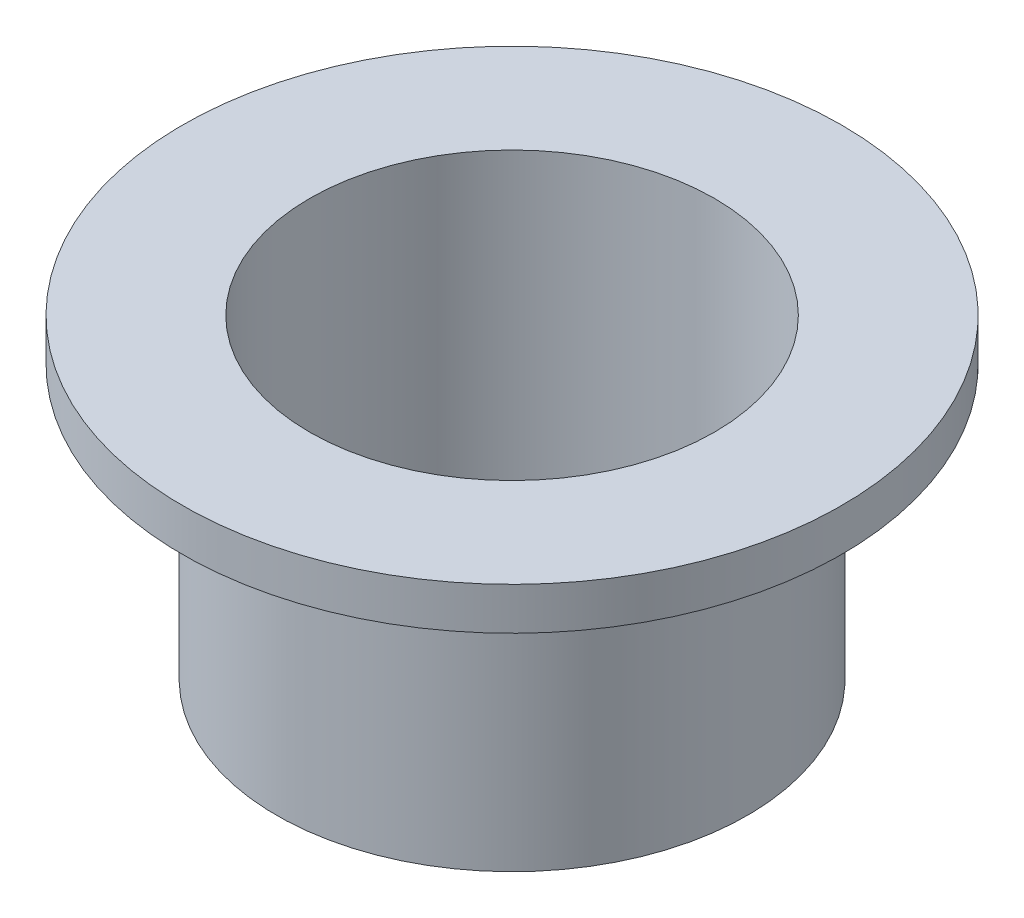
ISO-10303-21;
HEADER;
FILE_DESCRIPTION(('STEP AP214'),'2;1');
FILE_NAME('part.step','',(''),(''),'','','');
FILE_SCHEMA(('AUTOMOTIVE_DESIGN { 1 0 10303 214 1 1 1 1 }'));
ENDSEC;
DATA;
#1=APPLICATION_CONTEXT('core data for automotive mechanical design processes');
#2=APPLICATION_PROTOCOL_DEFINITION('international standard','automotive_design',2000,#1);
#3=PRODUCT_CONTEXT('',#1,'mechanical');
#4=PRODUCT('Part','Part','',(#3));
#5=PRODUCT_RELATED_PRODUCT_CATEGORY('part','',(#4));
#6=PRODUCT_DEFINITION_FORMATION('','',#4);
#7=PRODUCT_DEFINITION_CONTEXT('part definition',#1,'design');
#8=PRODUCT_DEFINITION('design','',#6,#7);
#9=PRODUCT_DEFINITION_SHAPE('','',#8);
#10=(LENGTH_UNIT() NAMED_UNIT(*) SI_UNIT(.MILLI.,.METRE.));
#11=(NAMED_UNIT(*) PLANE_ANGLE_UNIT() SI_UNIT($,.RADIAN.));
#12=(NAMED_UNIT(*) SI_UNIT($,.STERADIAN.) SOLID_ANGLE_UNIT());
#13=UNCERTAINTY_MEASURE_WITH_UNIT(LENGTH_MEASURE(1.E-05),#10,'distance_accuracy_value','');
#14=(GEOMETRIC_REPRESENTATION_CONTEXT(3) GLOBAL_UNCERTAINTY_ASSIGNED_CONTEXT((#13)) GLOBAL_UNIT_ASSIGNED_CONTEXT((#10,
#11,#12)) REPRESENTATION_CONTEXT('',''));
#15=CARTESIAN_POINT('',(0.,0.,0.));
#16=DIRECTION('',(0.,0.,1.));
#17=DIRECTION('',(1.,0.,0.));
#18=AXIS2_PLACEMENT_3D('',#15,#16,#17);
#19=CARTESIAN_POINT('',(-43.,-58.,0.));
#20=DIRECTION('',(0.,1.,0.));
#21=DIRECTION('',(0.,0.,1.));
#22=AXIS2_PLACEMENT_3D('',#19,#20,#21);
#23=PLANE('',#22);
#24=CARTESIAN_POINT('',(0.,-58.,0.));
#25=DIRECTION('',(0.,-1.,0.));
#26=DIRECTION('',(0.,0.,-1.));
#27=AXIS2_PLACEMENT_3D('',#24,#25,#26);
#28=CIRCLE('',#27,43.);
#29=CARTESIAN_POINT('',(0.,-58.,-43.));
#30=VERTEX_POINT('',#29);
#31=EDGE_CURVE('E59',#30,#30,#28,.T.);
#32=ORIENTED_EDGE('',*,*,#31,.F.);
#33=EDGE_LOOP('',(#32));
#34=FACE_BOUND('',#33,.T.);
#35=CARTESIAN_POINT('',(0.,-58.,0.));
#36=DIRECTION('',(0.,-1.,0.));
#37=DIRECTION('',(0.,0.,-1.));
#38=AXIS2_PLACEMENT_3D('',#35,#36,#37);
#39=CIRCLE('',#38,50.);
#40=CARTESIAN_POINT('',(0.,-58.,-50.));
#41=VERTEX_POINT('',#40);
#42=EDGE_CURVE('E10',#41,#41,#39,.T.);
#43=ORIENTED_EDGE('',*,*,#42,.T.);
#44=EDGE_LOOP('',(#43));
#45=FACE_BOUND('',#44,.T.);
#46=ADVANCED_FACE('F37',(#34,#45),#23,.F.);
#47=CARTESIAN_POINT('',(0.,-147.995737503109,0.));
#48=DIRECTION('',(0.,-1.,0.));
#49=DIRECTION('',(0.,0.,-1.));
#50=AXIS2_PLACEMENT_3D('',#47,#48,#49);
#51=CYLINDRICAL_SURFACE('',#50,50.);
#52=ORIENTED_EDGE('',*,*,#42,.F.);
#53=EDGE_LOOP('',(#52));
#54=FACE_BOUND('',#53,.T.);
#55=CARTESIAN_POINT('',(0.,0.,0.));
#56=DIRECTION('',(0.,-1.,0.));
#57=DIRECTION('',(0.,0.,-1.));
#58=AXIS2_PLACEMENT_3D('',#55,#56,#57);
#59=CIRCLE('',#58,50.);
#60=CARTESIAN_POINT('',(0.,0.,-50.));
#61=VERTEX_POINT('',#60);
#62=EDGE_CURVE('E43',#61,#61,#59,.T.);
#63=ORIENTED_EDGE('',*,*,#62,.T.);
#64=EDGE_LOOP('',(#63));
#65=FACE_BOUND('',#64,.T.);
#66=ADVANCED_FACE('F66',(#54,#65),#51,.T.);
#67=CARTESIAN_POINT('',(-50.,0.,0.));
#68=DIRECTION('',(0.,1.,0.));
#69=DIRECTION('',(0.,0.,1.));
#70=AXIS2_PLACEMENT_3D('',#67,#68,#69);
#71=PLANE('',#70);
#72=ORIENTED_EDGE('',*,*,#62,.F.);
#73=EDGE_LOOP('',(#72));
#74=FACE_BOUND('',#73,.T.);
#75=CARTESIAN_POINT('',(0.,0.,0.));
#76=DIRECTION('',(0.,-1.,0.));
#77=DIRECTION('',(0.,0.,-1.));
#78=AXIS2_PLACEMENT_3D('',#75,#76,#77);
#79=CIRCLE('',#78,70.);
#80=CARTESIAN_POINT('',(0.,0.,-70.));
#81=VERTEX_POINT('',#80);
#82=EDGE_CURVE('E47',#81,#81,#79,.T.);
#83=ORIENTED_EDGE('',*,*,#82,.T.);
#84=EDGE_LOOP('',(#83));
#85=FACE_BOUND('',#84,.T.);
#86=ADVANCED_FACE('F70',(#74,#85),#71,.F.);
#87=CARTESIAN_POINT('',(0.,-147.995737503109,0.));
#88=DIRECTION('',(0.,-1.,0.));
#89=DIRECTION('',(0.,0.,-1.));
#90=AXIS2_PLACEMENT_3D('',#87,#88,#89);
#91=CYLINDRICAL_SURFACE('',#90,70.);
#92=ORIENTED_EDGE('',*,*,#82,.F.);
#93=EDGE_LOOP('',(#92));
#94=FACE_BOUND('',#93,.T.);
#95=CARTESIAN_POINT('',(0.,9.00000000000001,0.));
#96=DIRECTION('',(0.,-1.,0.));
#97=DIRECTION('',(0.,0.,-1.));
#98=AXIS2_PLACEMENT_3D('',#95,#96,#97);
#99=CIRCLE('',#98,70.);
#100=CARTESIAN_POINT('',(0.,9.00000000000001,-70.));
#101=VERTEX_POINT('',#100);
#102=EDGE_CURVE('E51',#101,#101,#99,.T.);
#103=ORIENTED_EDGE('',*,*,#102,.T.);
#104=EDGE_LOOP('',(#103));
#105=FACE_BOUND('',#104,.T.);
#106=ADVANCED_FACE('F75',(#94,#105),#91,.T.);
#107=CARTESIAN_POINT('',(-70.,9.00000000000001,0.));
#108=DIRECTION('',(0.,-1.,0.));
#109=DIRECTION('',(0.,0.,-1.));
#110=AXIS2_PLACEMENT_3D('',#107,#108,#109);
#111=PLANE('',#110);
#112=ORIENTED_EDGE('',*,*,#102,.F.);
#113=EDGE_LOOP('',(#112));
#114=FACE_BOUND('',#113,.T.);
#115=CARTESIAN_POINT('',(0.,9.00000000000001,0.));
#116=DIRECTION('',(0.,-1.,0.));
#117=DIRECTION('',(0.,0.,-1.));
#118=AXIS2_PLACEMENT_3D('',#115,#116,#117);
#119=CIRCLE('',#118,43.);
#120=CARTESIAN_POINT('',(0.,9.00000000000001,-43.));
#121=VERTEX_POINT('',#120);
#122=EDGE_CURVE('E56',#121,#121,#119,.T.);
#123=ORIENTED_EDGE('',*,*,#122,.T.);
#124=EDGE_LOOP('',(#123));
#125=FACE_BOUND('',#124,.T.);
#126=ADVANCED_FACE('F81',(#114,#125),#111,.F.);
#127=CARTESIAN_POINT('',(0.,-147.995737503109,0.));
#128=DIRECTION('',(0.,-1.,0.));
#129=DIRECTION('',(0.,0.,-1.));
#130=AXIS2_PLACEMENT_3D('',#127,#128,#129);
#131=CYLINDRICAL_SURFACE('',#130,43.);
#132=ORIENTED_EDGE('',*,*,#122,.F.);
#133=EDGE_LOOP('',(#132));
#134=FACE_BOUND('',#133,.T.);
#135=ORIENTED_EDGE('',*,*,#31,.T.);
#136=EDGE_LOOP('',(#135));
#137=FACE_BOUND('',#136,.T.);
#138=ADVANCED_FACE('F63',(#134,#137),#131,.F.);
#139=CLOSED_SHELL('',(#46,#66,#86,#106,#126,#138));
#140=MANIFOLD_SOLID_BREP('B2',#139);
#141=ADVANCED_BREP_SHAPE_REPRESENTATION('',(#18,#140),#14);
#142=SHAPE_DEFINITION_REPRESENTATION(#9,#141);
ENDSEC;
END-ISO-10303-21;
